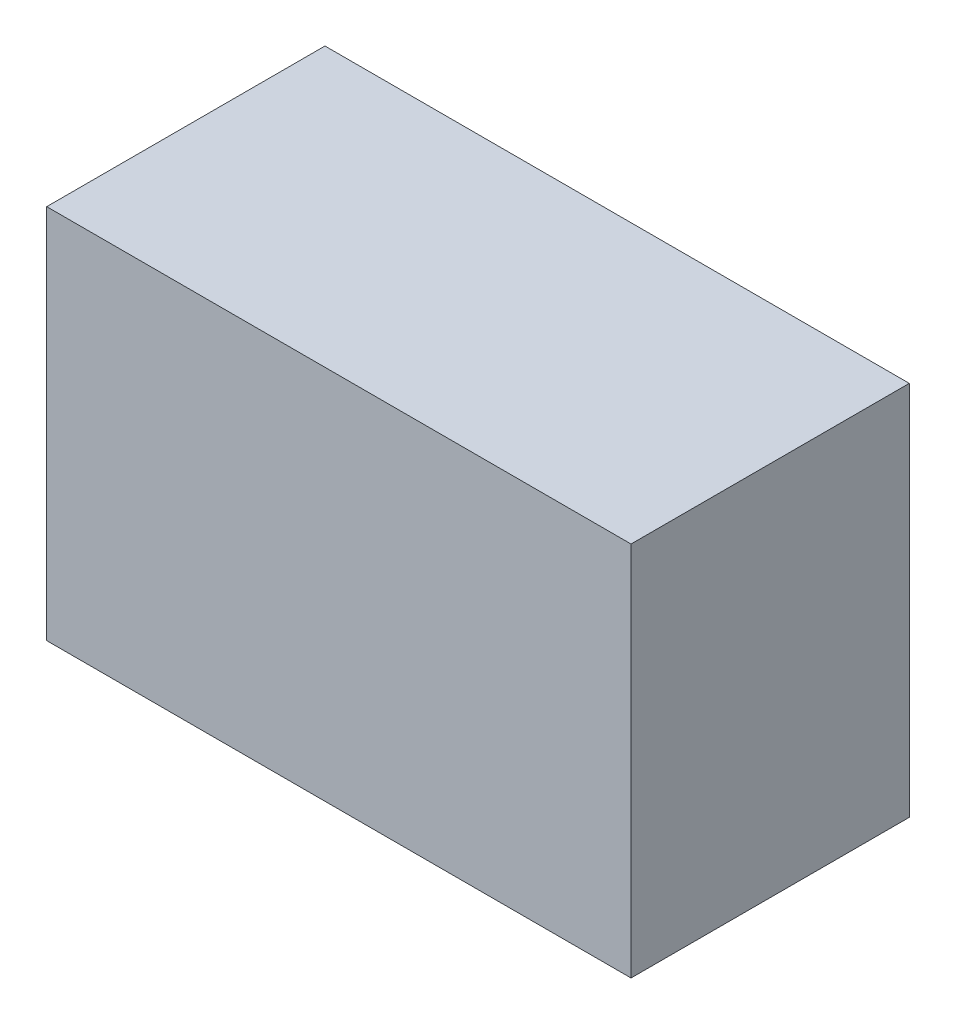
ISO-10303-21;
HEADER;
FILE_DESCRIPTION(('STEP AP214'),'2;1');
FILE_NAME('part.step','',(''),(''),'','','');
FILE_SCHEMA(('AUTOMOTIVE_DESIGN { 1 0 10303 214 1 1 1 1 }'));
ENDSEC;
DATA;
#1=APPLICATION_CONTEXT('core data for automotive mechanical design processes');
#2=APPLICATION_PROTOCOL_DEFINITION('international standard','automotive_design',2000,#1);
#3=PRODUCT_CONTEXT('',#1,'mechanical');
#4=PRODUCT('Part','Part','',(#3));
#5=PRODUCT_RELATED_PRODUCT_CATEGORY('part','',(#4));
#6=PRODUCT_DEFINITION_FORMATION('','',#4);
#7=PRODUCT_DEFINITION_CONTEXT('part definition',#1,'design');
#8=PRODUCT_DEFINITION('design','',#6,#7);
#9=PRODUCT_DEFINITION_SHAPE('','',#8);
#10=(LENGTH_UNIT() NAMED_UNIT(*) SI_UNIT(.MILLI.,.METRE.));
#11=(NAMED_UNIT(*) PLANE_ANGLE_UNIT() SI_UNIT($,.RADIAN.));
#12=(NAMED_UNIT(*) SI_UNIT($,.STERADIAN.) SOLID_ANGLE_UNIT());
#13=UNCERTAINTY_MEASURE_WITH_UNIT(LENGTH_MEASURE(1.E-05),#10,'distance_accuracy_value','');
#14=(GEOMETRIC_REPRESENTATION_CONTEXT(3) GLOBAL_UNCERTAINTY_ASSIGNED_CONTEXT((#13)) GLOBAL_UNIT_ASSIGNED_CONTEXT((#10,
#11,#12)) REPRESENTATION_CONTEXT('',''));
#15=CARTESIAN_POINT('',(0.,0.,0.));
#16=DIRECTION('',(0.,0.,1.));
#17=DIRECTION('',(1.,0.,0.));
#18=AXIS2_PLACEMENT_3D('',#15,#16,#17);
#19=CARTESIAN_POINT('',(7.62,21.082,1.6));
#20=DIRECTION('',(0.,0.,-1.));
#21=DIRECTION('',(0.,-1.,0.));
#22=AXIS2_PLACEMENT_3D('',#19,#20,#21);
#23=PLANE('',#22);
#24=DIRECTION('',(-1.,0.,0.));
#25=VECTOR('',#24,1.);
#26=CARTESIAN_POINT('',(6.57,21.7578,1.6));
#27=LINE('',#26,#25);
#28=CARTESIAN_POINT('',(8.67,21.7578,1.6));
#29=VERTEX_POINT('',#28);
#30=CARTESIAN_POINT('',(6.57,21.7578,1.6));
#31=VERTEX_POINT('',#30);
#32=EDGE_CURVE('E77',#29,#31,#27,.T.);
#33=ORIENTED_EDGE('',*,*,#32,.F.);
#34=DIRECTION('',(0.,1.,0.));
#35=VECTOR('',#34,1.);
#36=CARTESIAN_POINT('',(8.67,21.7578,1.6));
#37=LINE('',#36,#35);
#38=CARTESIAN_POINT('',(8.67,20.407,1.6));
#39=VERTEX_POINT('',#38);
#40=EDGE_CURVE('E27',#39,#29,#37,.T.);
#41=ORIENTED_EDGE('',*,*,#40,.F.);
#42=DIRECTION('',(1.,0.,0.));
#43=VECTOR('',#42,1.);
#44=CARTESIAN_POINT('',(8.67,20.407,1.6));
#45=LINE('',#44,#43);
#46=CARTESIAN_POINT('',(6.57,20.407,1.6));
#47=VERTEX_POINT('',#46);
#48=EDGE_CURVE('E92',#47,#39,#45,.T.);
#49=ORIENTED_EDGE('',*,*,#48,.F.);
#50=DIRECTION('',(0.,-1.,0.));
#51=VECTOR('',#50,1.);
#52=CARTESIAN_POINT('',(6.57,20.407,1.6));
#53=LINE('',#52,#51);
#54=EDGE_CURVE('E80',#31,#47,#53,.T.);
#55=ORIENTED_EDGE('',*,*,#54,.F.);
#56=EDGE_LOOP('',(#33,#41,#49,#55));
#57=FACE_BOUND('',#56,.T.);
#58=ADVANCED_FACE('F16',(#57),#23,.T.);
#59=CARTESIAN_POINT('',(7.62,21.082,2.6));
#60=DIRECTION('',(0.,0.,-1.));
#61=DIRECTION('',(0.,-1.,0.));
#62=AXIS2_PLACEMENT_3D('',#59,#60,#61);
#63=PLANE('',#62);
#64=DIRECTION('',(-1.,0.,0.));
#65=VECTOR('',#64,1.);
#66=CARTESIAN_POINT('',(6.57,21.7578,2.6));
#67=LINE('',#66,#65);
#68=CARTESIAN_POINT('',(8.67,21.7578,2.6));
#69=VERTEX_POINT('',#68);
#70=CARTESIAN_POINT('',(6.57,21.7578,2.6));
#71=VERTEX_POINT('',#70);
#72=EDGE_CURVE('E20',#69,#71,#67,.T.);
#73=ORIENTED_EDGE('',*,*,#72,.T.);
#74=DIRECTION('',(0.,-1.,0.));
#75=VECTOR('',#74,1.);
#76=CARTESIAN_POINT('',(6.57,20.407,2.6));
#77=LINE('',#76,#75);
#78=CARTESIAN_POINT('',(6.57,20.407,2.6));
#79=VERTEX_POINT('',#78);
#80=EDGE_CURVE('E94',#71,#79,#77,.T.);
#81=ORIENTED_EDGE('',*,*,#80,.T.);
#82=DIRECTION('',(1.,0.,0.));
#83=VECTOR('',#82,1.);
#84=CARTESIAN_POINT('',(8.67,20.407,2.6));
#85=LINE('',#84,#83);
#86=CARTESIAN_POINT('',(8.67,20.407,2.6));
#87=VERTEX_POINT('',#86);
#88=EDGE_CURVE('E71',#79,#87,#85,.T.);
#89=ORIENTED_EDGE('',*,*,#88,.T.);
#90=DIRECTION('',(0.,1.,0.));
#91=VECTOR('',#90,1.);
#92=CARTESIAN_POINT('',(8.67,21.7578,2.6));
#93=LINE('',#92,#91);
#94=EDGE_CURVE('E11',#87,#69,#93,.T.);
#95=ORIENTED_EDGE('',*,*,#94,.T.);
#96=EDGE_LOOP('',(#73,#81,#89,#95));
#97=FACE_BOUND('',#96,.T.);
#98=ADVANCED_FACE('F18',(#97),#63,.F.);
#99=CARTESIAN_POINT('',(8.67,21.7578,2.6));
#100=DIRECTION('',(-1.,0.,0.));
#101=DIRECTION('',(0.,0.,1.));
#102=AXIS2_PLACEMENT_3D('',#99,#100,#101);
#103=PLANE('',#102);
#104=ORIENTED_EDGE('',*,*,#40,.T.);
#105=DIRECTION('',(0.,0.,-1.));
#106=VECTOR('',#105,1.);
#107=CARTESIAN_POINT('',(8.67,21.7578,2.6));
#108=LINE('',#107,#106);
#109=EDGE_CURVE('E63',#69,#29,#108,.T.);
#110=ORIENTED_EDGE('',*,*,#109,.F.);
#111=ORIENTED_EDGE('',*,*,#94,.F.);
#112=DIRECTION('',(0.,0.,-1.));
#113=VECTOR('',#112,1.);
#114=CARTESIAN_POINT('',(8.67,20.407,2.6));
#115=LINE('',#114,#113);
#116=EDGE_CURVE('E66',#87,#39,#115,.T.);
#117=ORIENTED_EDGE('',*,*,#116,.T.);
#118=EDGE_LOOP('',(#104,#110,#111,#117));
#119=FACE_BOUND('',#118,.T.);
#120=ADVANCED_FACE('F62',(#119),#103,.F.);
#121=CARTESIAN_POINT('',(8.67,20.407,2.6));
#122=DIRECTION('',(0.,1.,0.));
#123=DIRECTION('',(1.,0.,0.));
#124=AXIS2_PLACEMENT_3D('',#121,#122,#123);
#125=PLANE('',#124);
#126=ORIENTED_EDGE('',*,*,#48,.T.);
#127=ORIENTED_EDGE('',*,*,#116,.F.);
#128=ORIENTED_EDGE('',*,*,#88,.F.);
#129=DIRECTION('',(0.,0.,-1.));
#130=VECTOR('',#129,1.);
#131=CARTESIAN_POINT('',(6.57,20.407,2.6));
#132=LINE('',#131,#130);
#133=EDGE_CURVE('E96',#79,#47,#132,.T.);
#134=ORIENTED_EDGE('',*,*,#133,.T.);
#135=EDGE_LOOP('',(#126,#127,#128,#134));
#136=FACE_BOUND('',#135,.T.);
#137=ADVANCED_FACE('F111',(#136),#125,.F.);
#138=CARTESIAN_POINT('',(6.57,20.407,2.6));
#139=DIRECTION('',(1.,0.,0.));
#140=DIRECTION('',(0.,-1.,0.));
#141=AXIS2_PLACEMENT_3D('',#138,#139,#140);
#142=PLANE('',#141);
#143=ORIENTED_EDGE('',*,*,#54,.T.);
#144=ORIENTED_EDGE('',*,*,#133,.F.);
#145=ORIENTED_EDGE('',*,*,#80,.F.);
#146=DIRECTION('',(0.,0.,-1.));
#147=VECTOR('',#146,1.);
#148=CARTESIAN_POINT('',(6.57,21.7578,2.6));
#149=LINE('',#148,#147);
#150=EDGE_CURVE('E85',#71,#31,#149,.T.);
#151=ORIENTED_EDGE('',*,*,#150,.T.);
#152=EDGE_LOOP('',(#143,#144,#145,#151));
#153=FACE_BOUND('',#152,.T.);
#154=ADVANCED_FACE('F114',(#153),#142,.F.);
#155=CARTESIAN_POINT('',(6.57,21.7578,2.6));
#156=DIRECTION('',(0.,-1.,0.));
#157=DIRECTION('',(-1.,0.,0.));
#158=AXIS2_PLACEMENT_3D('',#155,#156,#157);
#159=PLANE('',#158);
#160=ORIENTED_EDGE('',*,*,#32,.T.);
#161=ORIENTED_EDGE('',*,*,#150,.F.);
#162=ORIENTED_EDGE('',*,*,#72,.F.);
#163=ORIENTED_EDGE('',*,*,#109,.T.);
#164=EDGE_LOOP('',(#160,#161,#162,#163));
#165=FACE_BOUND('',#164,.T.);
#166=ADVANCED_FACE('F75',(#165),#159,.F.);
#167=CLOSED_SHELL('',(#58,#98,#120,#137,#154,#166));
#168=MANIFOLD_SOLID_BREP('B1',#167);
#169=ADVANCED_BREP_SHAPE_REPRESENTATION('',(#18,#168),#14);
#170=SHAPE_DEFINITION_REPRESENTATION(#9,#169);
ENDSEC;
END-ISO-10303-21;
